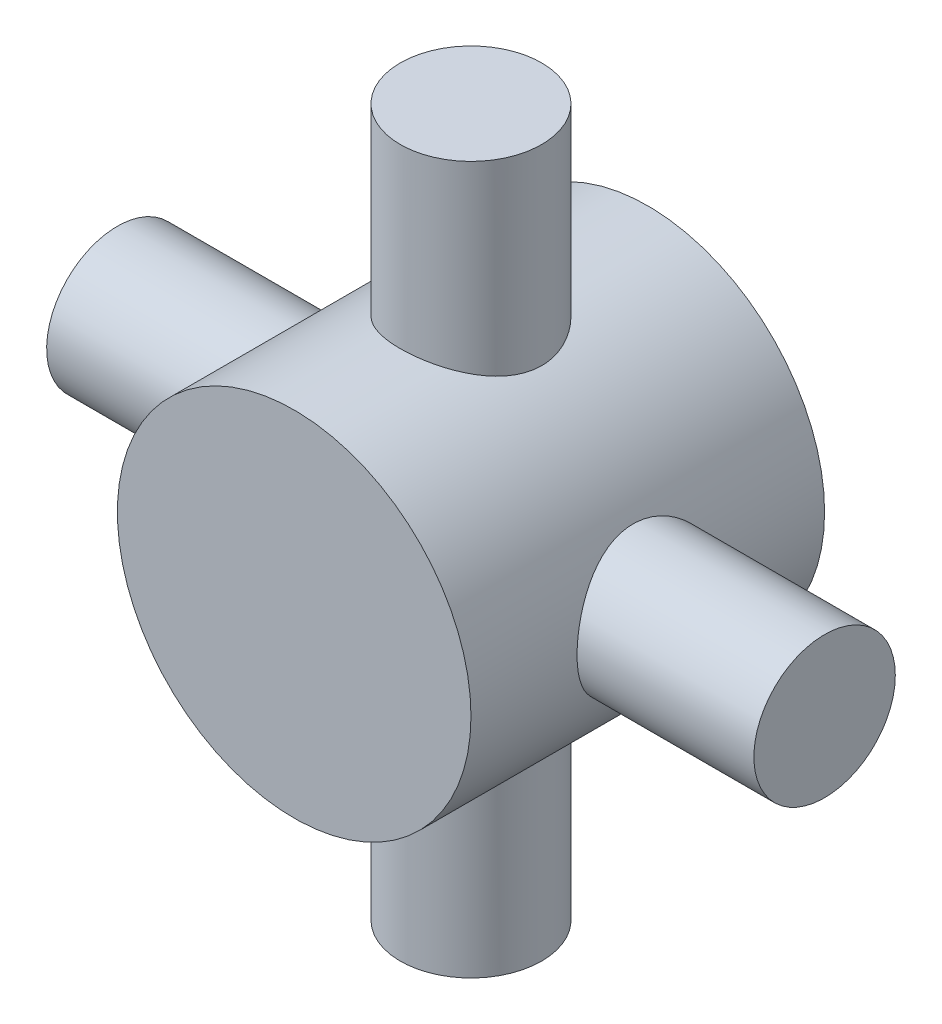
ISO-10303-21;
HEADER;
FILE_DESCRIPTION(('STEP AP214'),'2;1');
FILE_NAME('part.step','',(''),(''),'','','');
FILE_SCHEMA(('AUTOMOTIVE_DESIGN { 1 0 10303 214 1 1 1 1 }'));
ENDSEC;
DATA;
#1=APPLICATION_CONTEXT('core data for automotive mechanical design processes');
#2=APPLICATION_PROTOCOL_DEFINITION('international standard','automotive_design',2000,#1);
#3=PRODUCT_CONTEXT('',#1,'mechanical');
#4=PRODUCT('Part','Part','',(#3));
#5=PRODUCT_RELATED_PRODUCT_CATEGORY('part','',(#4));
#6=PRODUCT_DEFINITION_FORMATION('','',#4);
#7=PRODUCT_DEFINITION_CONTEXT('part definition',#1,'design');
#8=PRODUCT_DEFINITION('design','',#6,#7);
#9=PRODUCT_DEFINITION_SHAPE('','',#8);
#10=(LENGTH_UNIT() NAMED_UNIT(*) SI_UNIT(.MILLI.,.METRE.));
#11=(NAMED_UNIT(*) PLANE_ANGLE_UNIT() SI_UNIT($,.RADIAN.));
#12=(NAMED_UNIT(*) SI_UNIT($,.STERADIAN.) SOLID_ANGLE_UNIT());
#13=UNCERTAINTY_MEASURE_WITH_UNIT(LENGTH_MEASURE(1.E-05),#10,'distance_accuracy_value','');
#14=(GEOMETRIC_REPRESENTATION_CONTEXT(3) GLOBAL_UNCERTAINTY_ASSIGNED_CONTEXT((#13)) GLOBAL_UNIT_ASSIGNED_CONTEXT((#10,
#11,#12)) REPRESENTATION_CONTEXT('',''));
#15=CARTESIAN_POINT('',(0.,0.,0.));
#16=DIRECTION('',(0.,0.,1.));
#17=DIRECTION('',(1.,0.,0.));
#18=AXIS2_PLACEMENT_3D('',#15,#16,#17);
#19=CARTESIAN_POINT('',(0.,4.99999999999999,0.));
#20=DIRECTION('',(0.,-1.,0.));
#21=DIRECTION('',(0.,0.,-1.));
#22=AXIS2_PLACEMENT_3D('',#19,#20,#21);
#23=PLANE('',#22);
#24=CARTESIAN_POINT('',(0.,4.99999999999999,0.));
#25=DIRECTION('',(0.,1.,0.));
#26=DIRECTION('',(-1.,0.,0.));
#27=AXIS2_PLACEMENT_3D('',#24,#25,#26);
#28=CIRCLE('',#27,0.999999999999988);
#29=CARTESIAN_POINT('',(-0.999999999999987,4.99999999999999,0.));
#30=VERTEX_POINT('',#29);
#31=EDGE_CURVE('E20',#30,#30,#28,.F.);
#32=ORIENTED_EDGE('',*,*,#31,.F.);
#33=EDGE_LOOP('',(#32));
#34=FACE_BOUND('',#33,.T.);
#35=ADVANCED_FACE('F15',(#34),#23,.F.);
#36=CARTESIAN_POINT('',(0.,2.2750355745628,0.));
#37=DIRECTION('',(0.,1.,0.));
#38=DIRECTION('',(-1.,0.,0.));
#39=AXIS2_PLACEMENT_3D('',#36,#37,#38);
#40=CYLINDRICAL_SURFACE('',#39,0.999999999999988);
#41=ORIENTED_EDGE('',*,*,#31,.T.);
#42=EDGE_LOOP('',(#41));
#43=FACE_BOUND('',#42,.T.);
#44=CARTESIAN_POINT('',(0.999999999994078,2.29128784747409,-2.17927615693154E-07));
#45=CARTESIAN_POINT('',(0.999996707502593,2.29129119802611,0.0536136642229425));
#46=CARTESIAN_POINT('',(0.995666060081506,2.29319447821841,0.107275413313421));
#47=CARTESIAN_POINT('',(0.978520523269252,2.3005607742392,0.213017199103337));
#48=CARTESIAN_POINT('',(0.965692778855676,2.30602918345448,0.265094714008471));
#49=CARTESIAN_POINT('',(0.932120027155969,2.31980118266166,0.366020635915594));
#50=CARTESIAN_POINT('',(0.911401764908779,2.32809518535032,0.414879304143902));
#51=CARTESIAN_POINT('',(0.862717676849073,2.3465706003288,0.508430073378591));
#52=CARTESIAN_POINT('',(0.834751501712457,2.35675210358283,0.553121973420083));
#53=CARTESIAN_POINT('',(0.770660143547025,2.37850460731377,0.639631470975835));
#54=CARTESIAN_POINT('',(0.734187607655451,2.39012024880496,0.681180608037843));
#55=CARTESIAN_POINT('',(0.654852110281877,2.41306293125457,0.757766459284194));
#56=CARTESIAN_POINT('',(0.611987314896724,2.42438988829552,0.792801298050814));
#57=CARTESIAN_POINT('',(0.519003623801254,2.44601693422006,0.856702901877684));
#58=CARTESIAN_POINT('',(0.468665231928407,2.45625886886434,0.885271736656966));
#59=CARTESIAN_POINT('',(0.363413468464916,2.47401952507406,0.933421486290974));
#60=CARTESIAN_POINT('',(0.308501921956267,2.48153932665932,0.953005966559185));
#61=CARTESIAN_POINT('',(0.198483501361336,2.49269160137067,0.981670683743747));
#62=CARTESIAN_POINT('',(0.143514817362762,2.49649466443976,0.991213608518361));
#63=CARTESIAN_POINT('',(0.0326334872699018,2.50040155000967,1.00101423406867));
#64=CARTESIAN_POINT('',(-0.0232788002511603,2.5005067473981,1.00127538586105));
#65=CARTESIAN_POINT('',(-0.131116001010387,2.49710982692897,0.992758648199157));
#66=CARTESIAN_POINT('',(-0.183088476697845,2.49381000201477,0.984487662628688));
#67=CARTESIAN_POINT('',(-0.284836314035162,2.48424648527275,0.960003630832431));
#68=CARTESIAN_POINT('',(-0.334611513612494,2.47798257521011,0.9437899998154));
#69=CARTESIAN_POINT('',(-0.431449672626536,2.46298401720902,0.903681491260463));
#70=CARTESIAN_POINT('',(-0.478460369156069,2.45421351164455,0.879674394002807));
#71=CARTESIAN_POINT('',(-0.567905481629829,2.43507258232656,0.824766425613066));
#72=CARTESIAN_POINT('',(-0.610338494794237,2.42470167049934,0.793863450167871));
#73=CARTESIAN_POINT('',(-0.692378333082344,2.40260981954793,0.723680807475965));
#74=CARTESIAN_POINT('',(-0.731617771188206,2.39084494767578,0.683984933087846));
#75=CARTESIAN_POINT('',(-0.803044623935689,2.36781151648148,0.598517049002709));
#76=CARTESIAN_POINT('',(-0.835227759731151,2.35654326159149,0.552741379463758));
#77=CARTESIAN_POINT('',(-0.892473903058591,2.33547633088083,0.454755311537515));
#78=CARTESIAN_POINT('',(-0.917304382121705,2.32572950822627,0.402397233653717));
#79=CARTESIAN_POINT('',(-0.957612539624336,2.30942814837567,0.293797129279246));
#80=CARTESIAN_POINT('',(-0.973110407016686,2.30286672630767,0.237563782086274));
#81=CARTESIAN_POINT('',(-0.989051268465935,2.29604185038478,0.150637640860977));
#82=CARTESIAN_POINT('',(-0.99315014986751,2.29426714424267,0.120690248825355));
#83=CARTESIAN_POINT('',(-0.998625437813802,2.2918892002622,0.060500281623118));
#84=CARTESIAN_POINT('',(-1.00000186805585,2.29128595222701,0.0302577090281769));
#85=CARTESIAN_POINT('',(-0.999996689988203,2.2912912056767,-0.0536139948529055));
#86=CARTESIAN_POINT('',(-0.995666024435301,2.29319449377915,-0.107275745744278));
#87=CARTESIAN_POINT('',(-0.978520451059013,2.30056080503024,-0.213017531465941));
#88=CARTESIAN_POINT('',(-0.965692688262371,2.30602922154397,-0.265095044506567));
#89=CARTESIAN_POINT('',(-0.932119900214202,2.31980123381903,-0.366020959561903));
#90=CARTESIAN_POINT('',(-0.911401619995746,2.32809524228386,-0.414879622811765));
#91=CARTESIAN_POINT('',(-0.862717496636081,2.34657066678641,-0.508430379433239));
#92=CARTESIAN_POINT('',(-0.834751304161644,2.35675217379061,-0.553122271834562));
#93=CARTESIAN_POINT('',(-0.770659910571959,2.37850468306931,-0.639631752039432));
#94=CARTESIAN_POINT('',(-0.734187356486594,2.39012032625432,-0.681180879140111));
#95=CARTESIAN_POINT('',(-0.654851823652083,2.41306300933198,-0.75776670732778));
#96=CARTESIAN_POINT('',(-0.611987011004798,2.42438996530658,-0.79280153300102));
#97=CARTESIAN_POINT('',(-0.51900329064386,2.44601700514117,-0.8567031037167));
#98=CARTESIAN_POINT('',(-0.468664887376376,2.45625893479309,-0.885271919089057));
#99=CARTESIAN_POINT('',(-0.363413104525144,2.47401957871679,-0.93342162800406));
#100=CARTESIAN_POINT('',(-0.308501550024957,2.48153937301103,-0.953006086966616));
#101=CARTESIAN_POINT('',(-0.198483121880908,2.49269163160682,-0.981670760250796));
#102=CARTESIAN_POINT('',(-0.143514438322801,2.49649468616487,-0.991213663148361));
#103=CARTESIAN_POINT('',(-0.0326331133037834,2.50040155482913,-1.00101424601763));
#104=CARTESIAN_POINT('',(0.0232791695860272,2.5005067438208,-1.0012753770003));
#105=CARTESIAN_POINT('',(0.131116360536903,2.49710980798707,-0.992758600620381));
#106=CARTESIAN_POINT('',(0.183088831210155,2.49380997586689,-0.984487596582289));
#107=CARTESIAN_POINT('',(0.284836655581448,2.48424644599281,-0.960003529378298));
#108=CARTESIAN_POINT('',(0.33461184720594,2.47798253000308,-0.943789881418363));
#109=CARTESIAN_POINT('',(0.431449992117311,2.46298396116066,-0.903681338855443));
#110=CARTESIAN_POINT('',(0.478460682154936,2.45421345049765,-0.879674223901451));
#111=CARTESIAN_POINT('',(0.567905778992694,2.43507251284869,-0.824766221009757));
#112=CARTESIAN_POINT('',(0.61033878301193,2.4247015977895,-0.793863228758814));
#113=CARTESIAN_POINT('',(0.692378600396833,2.40260974233963,-0.723680551997098));
#114=CARTESIAN_POINT('',(0.731618026505073,2.39084486934377,-0.683984660331514));
#115=CARTESIAN_POINT('',(0.803044852339762,2.3678114388139,-0.598516742930602));
#116=CARTESIAN_POINT('',(0.835227973212748,2.35654318571424,-0.552741057349385));
#117=CARTESIAN_POINT('',(0.892474080528133,2.3354762628009,-0.454754963222833));
#118=CARTESIAN_POINT('',(0.91730453915312,2.32572944608067,-0.40239687570926));
#119=CARTESIAN_POINT('',(0.95761265410948,2.30942810069306,-0.293796756003865));
#120=CARTESIAN_POINT('',(0.973110499466877,2.30286668712436,-0.237563403132154));
#121=CARTESIAN_POINT('',(0.989051305568216,2.29604183431252,-0.150637373444792));
#122=CARTESIAN_POINT('',(0.99315016445451,2.29426713791307,-0.120690098920057));
#123=CARTESIAN_POINT('',(0.998625428900689,2.29188920412762,-0.060500369157009));
#124=CARTESIAN_POINT('',(1.00000185815489,2.29128595654605,-0.0302579164900438));
#125=CARTESIAN_POINT('',(0.999999999994078,2.29128784747409,-2.17927615693154E-07));
#126=B_SPLINE_CURVE_WITH_KNOTS('',3,(#44,#45,#46,#47,#48,#49,#50,#51,#52,#53,#54,#55,#56,#57,
#58,#59,#60,#61,#62,#63,#64,#65,#66,#67,#68,#69,#70,#71,#72,#73,#74,#75,#76,#77,#78,#79,#80,#81,
#82,#83,#84,#85,#86,#87,#88,#89,#90,#91,#92,#93,#94,#95,#96,#97,#98,#99,#100,#101,#102,#103,
#104,#105,#106,#107,#108,#109,#110,#111,#112,#113,#114,#115,#116,#117,#118,#119,#120,#121,#122,
#123,#124,#125),.UNSPECIFIED.,.T.,.F.,(4,2,2,2,2,2,2,2,2,2,2,2,2,2,2,2,2,2,2,2,2,2,2,2,2,2,2,2,
2,2,2,2,2,2,2,2,2,2,2,2,4),(0.,0.160722467328683,0.321688644266385,0.482114010737845,
0.64254711059031,0.811283213638927,0.98006781958772,1.15551239474912,1.33088728491167,
1.49777076455765,1.66459219531501,1.82204317578564,1.97950575060441,2.13934447256627,
2.29923203700972,2.46959649751566,2.64006398075104,2.81545564092535,2.99046650579592,
3.08117348850921,3.17187968166847,3.33260215977153,3.49356834655952,3.65399372294214,
3.814426832909,3.98316295010182,4.15194757007314,4.32739214349058,4.50276703179898,
4.66965049734785,4.83647191410893,4.99392288992339,5.15138546014328,5.31122419130196,
5.47111176495441,5.64147623732487,5.81194373256506,5.98733538957807,6.16234624997625,
6.25305287481712,6.34375871020104),.UNSPECIFIED.);
#127=CARTESIAN_POINT('',(0.999999999994078,2.29128784747409,-2.17927615693154E-07));
#128=VERTEX_POINT('',#127);
#129=EDGE_CURVE('E74',#128,#128,#126,.T.);
#130=ORIENTED_EDGE('',*,*,#129,.F.);
#131=EDGE_LOOP('',(#130));
#132=FACE_BOUND('',#131,.T.);
#133=ADVANCED_FACE('F79',(#43,#132),#40,.T.);
#134=CARTESIAN_POINT('',(4.99999999999999,0.,0.));
#135=DIRECTION('',(-1.,0.,0.));
#136=DIRECTION('',(0.,0.,1.));
#137=AXIS2_PLACEMENT_3D('',#134,#135,#136);
#138=PLANE('',#137);
#139=CARTESIAN_POINT('',(4.99999999999999,0.,0.));
#140=DIRECTION('',(1.,0.,0.));
#141=DIRECTION('',(0.,0.,-1.));
#142=AXIS2_PLACEMENT_3D('',#139,#140,#141);
#143=CIRCLE('',#142,0.999999999999988);
#144=CARTESIAN_POINT('',(4.99999999999999,0.,-0.999999999999988));
#145=VERTEX_POINT('',#144);
#146=EDGE_CURVE('E72',#145,#145,#143,.F.);
#147=ORIENTED_EDGE('',*,*,#146,.F.);
#148=EDGE_LOOP('',(#147));
#149=FACE_BOUND('',#148,.T.);
#150=ADVANCED_FACE('F84',(#149),#138,.F.);
#151=CARTESIAN_POINT('',(-4.99999999999999,0.,0.));
#152=DIRECTION('',(1.,0.,0.));
#153=DIRECTION('',(0.,0.,-1.));
#154=AXIS2_PLACEMENT_3D('',#151,#152,#153);
#155=PLANE('',#154);
#156=CARTESIAN_POINT('',(-4.99999999999999,0.,0.));
#157=DIRECTION('',(-1.,0.,0.));
#158=DIRECTION('',(0.,-1.,0.));
#159=AXIS2_PLACEMENT_3D('',#156,#157,#158);
#160=CIRCLE('',#159,0.999999999999988);
#161=CARTESIAN_POINT('',(-4.99999999999999,-0.999999999999987,0.));
#162=VERTEX_POINT('',#161);
#163=EDGE_CURVE('E69',#162,#162,#160,.F.);
#164=ORIENTED_EDGE('',*,*,#163,.F.);
#165=EDGE_LOOP('',(#164));
#166=FACE_BOUND('',#165,.T.);
#167=ADVANCED_FACE('F88',(#166),#155,.F.);
#168=CARTESIAN_POINT('',(0.,-4.99999999999999,0.));
#169=DIRECTION('',(0.,1.,0.));
#170=DIRECTION('',(0.,0.,1.));
#171=AXIS2_PLACEMENT_3D('',#168,#169,#170);
#172=PLANE('',#171);
#173=CARTESIAN_POINT('',(0.,-4.99999999999999,0.));
#174=DIRECTION('',(0.,-1.,0.));
#175=DIRECTION('',(1.,0.,0.));
#176=AXIS2_PLACEMENT_3D('',#173,#174,#175);
#177=CIRCLE('',#176,0.999999999999988);
#178=CARTESIAN_POINT('',(0.999999999999987,-4.99999999999999,0.));
#179=VERTEX_POINT('',#178);
#180=EDGE_CURVE('E66',#179,#179,#177,.F.);
#181=ORIENTED_EDGE('',*,*,#180,.F.);
#182=EDGE_LOOP('',(#181));
#183=FACE_BOUND('',#182,.T.);
#184=ADVANCED_FACE('F91',(#183),#172,.F.);
#185=CARTESIAN_POINT('',(0.,0.,-2.50000000000001));
#186=DIRECTION('',(0.,0.,-1.));
#187=DIRECTION('',(-1.,0.,0.));
#188=AXIS2_PLACEMENT_3D('',#185,#186,#187);
#189=PLANE('',#188);
#190=CARTESIAN_POINT('',(0.,0.,-2.50000000000001));
#191=DIRECTION('',(0.,0.,1.));
#192=DIRECTION('',(1.,0.,0.));
#193=AXIS2_PLACEMENT_3D('',#190,#191,#192);
#194=CIRCLE('',#193,2.50000000000001);
#195=CARTESIAN_POINT('',(2.50000000000001,0.,-2.50000000000001));
#196=VERTEX_POINT('',#195);
#197=EDGE_CURVE('E63',#196,#196,#194,.T.);
#198=ORIENTED_EDGE('',*,*,#197,.F.);
#199=EDGE_LOOP('',(#198));
#200=FACE_BOUND('',#199,.T.);
#201=ADVANCED_FACE('F54',(#200),#189,.T.);
#202=CARTESIAN_POINT('',(2.2750355745628,0.,0.));
#203=DIRECTION('',(1.,0.,0.));
#204=DIRECTION('',(0.,0.,-1.));
#205=AXIS2_PLACEMENT_3D('',#202,#203,#204);
#206=CYLINDRICAL_SURFACE('',#205,0.999999999999988);
#207=ORIENTED_EDGE('',*,*,#146,.T.);
#208=EDGE_LOOP('',(#207));
#209=FACE_BOUND('',#208,.T.);
#210=CARTESIAN_POINT('',(2.50000000000001,0.,-0.999999999999988));
#211=CARTESIAN_POINT('',(2.49999832714328,-0.053840173868081,-0.999997923084856));
#212=CARTESIAN_POINT('',(2.4982435108474,-0.10770267365812,-0.995633281938908));
#213=CARTESIAN_POINT('',(2.4914068441987,-0.213839462081154,-0.978350168268459));
#214=CARTESIAN_POINT('',(2.4863224345941,-0.266112496622602,-0.965425115799957));
#215=CARTESIAN_POINT('',(2.47337266537937,-0.367468219325445,-0.931566052287496));
#216=CARTESIAN_POINT('',(2.46551432763939,-0.416558596001349,-0.910652252929983));
#217=CARTESIAN_POINT('',(2.4477875356438,-0.510514648709454,-0.86150327055249));
#218=CARTESIAN_POINT('',(2.43791886017528,-0.555379859018935,-0.833267281722236));
#219=CARTESIAN_POINT('',(2.41665468324853,-0.64174973025198,-0.768883093669729));
#220=CARTESIAN_POINT('',(2.40521199792037,-0.683029284074287,-0.732448671320707));
#221=CARTESIAN_POINT('',(2.38230341582586,-0.759085887708245,-0.653301606641646));
#222=CARTESIAN_POINT('',(2.37083750993646,-0.793859458713734,-0.610585627184905));
#223=CARTESIAN_POINT('',(2.34860907848086,-0.857451007629905,-0.517767074361221));
#224=CARTESIAN_POINT('',(2.3379012953495,-0.885931238379492,-0.467418866047939));
#225=CARTESIAN_POINT('',(2.31916147879465,-0.93389465983473,-0.362179664845194));
#226=CARTESIAN_POINT('',(2.31112591285993,-0.953389741641312,-0.307294790033432));
#227=CARTESIAN_POINT('',(2.30054811890686,-0.978574006495495,-0.210171444971434));
#228=CARTESIAN_POINT('',(2.2971019719271,-0.986588200391506,-0.168621393484938));
#229=CARTESIAN_POINT('',(2.29247113496057,-0.997301589242009,-0.0847188971027677));
#230=CARTESIAN_POINT('',(2.2912860398814,-1.00000173626936,-0.0423665973121838));
#231=CARTESIAN_POINT('',(2.29129013633143,-0.999997801463861,0.0536458434076669));
#232=CARTESIAN_POINT('',(2.29319546594728,-0.995663492002343,0.107314479498848));
#233=CARTESIAN_POINT('',(2.30056461630025,-0.978511854714129,0.213047361261767));
#234=CARTESIAN_POINT('',(2.30603150712417,-0.96568720801193,0.265110182121807));
#235=CARTESIAN_POINT('',(2.31980070632238,-0.932121094951657,0.366018700844813));
#236=CARTESIAN_POINT('',(2.32809419246134,-0.911404237975104,0.414873851191407));
#237=CARTESIAN_POINT('',(2.34656942823428,-0.862720907739187,0.508424566484586));
#238=CARTESIAN_POINT('',(2.35675148920328,-0.834753238867404,0.553119443775409));
#239=CARTESIAN_POINT('',(2.37850390718751,-0.770662283209919,0.639628777297083));
#240=CARTESIAN_POINT('',(2.39011879893465,-0.734192491464488,0.681175400915639));
#241=CARTESIAN_POINT('',(2.41306151143783,-0.654857149705665,0.757762087294584));
#242=CARTESIAN_POINT('',(2.42438921190131,-0.611988969805669,0.792799461246696));
#243=CARTESIAN_POINT('',(2.44602157014783,-0.518984995119655,0.856716431504877));
#244=CARTESIAN_POINT('',(2.45626751101058,-0.468627741475795,0.885295186015296));
#245=CARTESIAN_POINT('',(2.47402583332619,-0.363362385819108,0.933438562460561));
#246=CARTESIAN_POINT('',(2.48154157462813,-0.308459980099774,0.953014271709865));
#247=CARTESIAN_POINT('',(2.49141035181088,-0.21113755206582,0.978375646143846));
#248=CARTESIAN_POINT('',(2.49461196692088,-0.169390197125353,0.98646499025934));
#249=CARTESIAN_POINT('',(2.49890731681082,-0.0850998091062024,0.997277643475411));
#250=CARTESIAN_POINT('',(2.500001322272,-0.0425568789123114,1.0000016416507));
#251=CARTESIAN_POINT('',(2.49999832714815,0.0538401739827356,0.999997923091098));
#252=CARTESIAN_POINT('',(2.4982435108445,0.107702673798753,0.995633281930207));
#253=CARTESIAN_POINT('',(2.49140684418548,0.213839462190523,0.978350168236428));
#254=CARTESIAN_POINT('',(2.48632243458614,0.266112496678589,0.965425115779619));
#255=CARTESIAN_POINT('',(2.47337266538141,0.367468219315742,0.931566052292367));
#256=CARTESIAN_POINT('',(2.46551432764361,0.416558595976571,0.910652252941023));
#257=CARTESIAN_POINT('',(2.44778753564888,0.51051464868494,0.861503270567236));
#258=CARTESIAN_POINT('',(2.43791886017799,0.555379859007548,0.833267281730693));
#259=CARTESIAN_POINT('',(2.41665468324576,0.641749730263672,0.768883093661046));
#260=CARTESIAN_POINT('',(2.40521199791446,0.683029284095803,0.732448671301014));
#261=CARTESIAN_POINT('',(2.38230341581995,0.759085887725992,0.653301606620479));
#262=CARTESIAN_POINT('',(2.37083750993369,0.793859458721245,0.610585627176497));
#263=CARTESIAN_POINT('',(2.34860907849422,0.857451007592112,0.517767074413713));
#264=CARTESIAN_POINT('',(2.33790129537461,0.885931238314277,0.467418866153549));
#265=CARTESIAN_POINT('',(2.31916147881392,0.933894659786355,0.362179664988715));
#266=CARTESIAN_POINT('',(2.31112591286788,0.95338974161609,0.307294790150817));
#267=CARTESIAN_POINT('',(2.30054811510167,0.978574015559668,0.210171410000802));
#268=CARTESIAN_POINT('',(2.29710196602288,0.986588214136999,0.168621322197774));
#269=CARTESIAN_POINT('',(2.29247112894675,0.997301603067924,0.0847187524801078));
#270=CARTESIAN_POINT('',(2.29128603585487,1.00000174549937,0.0423664156711983));
#271=CARTESIAN_POINT('',(2.2912901414281,0.999997789778293,-0.0536460637138275));
#272=CARTESIAN_POINT('',(2.29319547631843,0.995663468239362,-0.107314700976306));
#273=CARTESIAN_POINT('',(2.30056463681906,0.978511806598473,-0.213047582723829));
#274=CARTESIAN_POINT('',(2.30603153251083,0.965687147632724,-0.265110402397518));
#275=CARTESIAN_POINT('',(2.31980074042958,0.932121010316976,-0.366018916626548));
#276=CARTESIAN_POINT('',(2.32809423042287,0.911404141351788,-0.414874063673542));
#277=CARTESIAN_POINT('',(2.34656947254699,0.862720787577108,-0.508424770557167));
#278=CARTESIAN_POINT('',(2.35675153601288,0.834753107154189,-0.553119642737114));
#279=CARTESIAN_POINT('',(2.37850395768848,0.770662127901707,-0.639628964662389));
#280=CARTESIAN_POINT('',(2.39011885056112,0.734192324040813,-0.681175581628587));
#281=CARTESIAN_POINT('',(2.4130615634834,0.654856958642804,-0.757762252639386));
#282=CARTESIAN_POINT('',(2.42438926323968,0.611988767218563,-0.79279961787407));
#283=CARTESIAN_POINT('',(2.4460216174424,0.518984772951155,-0.856716566102425));
#284=CARTESIAN_POINT('',(2.45626755498718,0.468627511651131,-0.885295307699411));
#285=CARTESIAN_POINT('',(2.47402586910357,0.363362143029287,-0.933438656976586));
#286=CARTESIAN_POINT('',(2.48154160553418,0.308459732011866,-0.953014351999295));
#287=CARTESIAN_POINT('',(2.4914103692168,0.211137339008969,-0.978375690264006));
#288=CARTESIAN_POINT('',(2.49461197787209,0.169390025231055,-0.986465017903118));
#289=CARTESIAN_POINT('',(2.49890731906129,0.0850997219612367,-0.997277649063196));
#290=CARTESIAN_POINT('',(2.50000132227449,0.0425568353532825,-1.00000164165396));
#291=CARTESIAN_POINT('',(2.50000000000001,0.,-0.999999999999988));
#292=B_SPLINE_CURVE_WITH_KNOTS('',3,(#210,#211,#212,#213,#214,#215,#216,#217,#218,#219,#220,
#221,#222,#223,#224,#225,#226,#227,#228,#229,#230,#231,#232,#233,#234,#235,#236,#237,#238,#239,
#240,#241,#242,#243,#244,#245,#246,#247,#248,#249,#250,#251,#252,#253,#254,#255,#256,#257,#258,
#259,#260,#261,#262,#263,#264,#265,#266,#267,#268,#269,#270,#271,#272,#273,#274,#275,#276,#277,
#278,#279,#280,#281,#282,#283,#284,#285,#286,#287,#288,#289,#290,#291),.UNSPECIFIED.,.T.,.F.,(4,
2,2,2,2,2,2,2,2,2,2,2,2,2,2,2,2,2,2,2,2,2,2,2,2,2,2,2,2,2,2,2,2,2,2,2,2,2,2,2,4),(0.,
0.161358816058386,0.322841804431311,0.48391891505938,0.645013759824909,0.812983083447207,
0.981041966649066,1.15665108370802,1.33202712454866,1.45902009098211,1.58599030308716,
1.74676523562868,1.90767894081388,2.0680949405241,2.22853740864722,2.39726299193862,
2.56605811733116,2.74157622448184,2.91687759719383,3.04443680049976,3.17197962022939,
3.3333384364772,3.49482142466068,3.65589853524664,3.81699338005428,3.98496270371981,
4.15302158687844,4.3286307037304,4.50400674477799,4.6309998199689,4.75797014073239,
4.91874508025775,5.07965879220759,5.24007479858073,5.40051727339182,5.56924286606018,
5.73803800085389,5.91355610706353,6.08885747831783,6.21641655109891,6.34395924040416),.UNSPECIFIED.);
#293=CARTESIAN_POINT('',(2.50000000000001,0.,-0.999999999999988));
#294=VERTEX_POINT('',#293);
#295=EDGE_CURVE('E58',#294,#294,#292,.T.);
#296=ORIENTED_EDGE('',*,*,#295,.F.);
#297=EDGE_LOOP('',(#296));
#298=FACE_BOUND('',#297,.T.);
#299=ADVANCED_FACE('F49',(#209,#298),#206,.T.);
#300=CARTESIAN_POINT('',(0.,0.,2.50000000000001));
#301=DIRECTION('',(0.,0.,-1.));
#302=DIRECTION('',(-1.,0.,0.));
#303=AXIS2_PLACEMENT_3D('',#300,#301,#302);
#304=PLANE('',#303);
#305=CARTESIAN_POINT('',(0.,0.,2.50000000000001));
#306=DIRECTION('',(0.,0.,1.));
#307=DIRECTION('',(1.,0.,0.));
#308=AXIS2_PLACEMENT_3D('',#305,#306,#307);
#309=CIRCLE('',#308,2.50000000000001);
#310=CARTESIAN_POINT('',(2.50000000000001,0.,2.50000000000001));
#311=VERTEX_POINT('',#310);
#312=EDGE_CURVE('E29',#311,#311,#309,.F.);
#313=ORIENTED_EDGE('',*,*,#312,.F.);
#314=EDGE_LOOP('',(#313));
#315=FACE_BOUND('',#314,.T.);
#316=ADVANCED_FACE('F45',(#315),#304,.F.);
#317=CARTESIAN_POINT('',(-2.2750355745628,0.,0.));
#318=DIRECTION('',(-1.,0.,0.));
#319=DIRECTION('',(0.,-1.,0.));
#320=AXIS2_PLACEMENT_3D('',#317,#318,#319);
#321=CYLINDRICAL_SURFACE('',#320,0.999999999999988);
#322=CARTESIAN_POINT('',(-2.29128784747793,0.999999999999988,0.));
#323=CARTESIAN_POINT('',(-2.2912901414281,0.999997789778294,0.0536460637138044));
#324=CARTESIAN_POINT('',(-2.29319547631843,0.995663468239366,0.107314700976259));
#325=CARTESIAN_POINT('',(-2.30056463681906,0.978511806598484,0.213047582723784));
#326=CARTESIAN_POINT('',(-2.30603153251082,0.965687147632732,0.265110402397497));
#327=CARTESIAN_POINT('',(-2.31980074042958,0.932121010316974,0.366018916626553));
#328=CARTESIAN_POINT('',(-2.32809423042288,0.911404141351783,0.414874063673554));
#329=CARTESIAN_POINT('',(-2.34656947254699,0.862720787577102,0.508424770557177));
#330=CARTESIAN_POINT('',(-2.35675153601288,0.834753107154186,0.553119642737118));
#331=CARTESIAN_POINT('',(-2.37850395768848,0.770662127901703,0.639628964662395));
#332=CARTESIAN_POINT('',(-2.39011885056113,0.734192324040805,0.681175581628597));
#333=CARTESIAN_POINT('',(-2.4130615634834,0.654856958642794,0.757762252639394));
#334=CARTESIAN_POINT('',(-2.42438926323968,0.611988767218557,0.792799617874074));
#335=CARTESIAN_POINT('',(-2.4460216174424,0.518984772951177,0.856716566102411));
#336=CARTESIAN_POINT('',(-2.45626755498717,0.468627511651176,0.885295307699386));
#337=CARTESIAN_POINT('',(-2.47402586910357,0.363362143029336,0.933438656976569));
#338=CARTESIAN_POINT('',(-2.48154160553418,0.308459732011891,0.953014351999288));
#339=CARTESIAN_POINT('',(-2.4914103692168,0.21113733900894,0.978375690264014));
#340=CARTESIAN_POINT('',(-2.4946119778721,0.169390025230996,0.986465017903129));
#341=CARTESIAN_POINT('',(-2.49890731906129,0.0850997219611769,0.9972776490632));
#342=CARTESIAN_POINT('',(-2.50000132227449,0.0425568353532529,1.00000164165396));
#343=CARTESIAN_POINT('',(-2.49999832714328,-0.0538401738681144,0.999997923084856));
#344=CARTESIAN_POINT('',(-2.4982435108474,-0.107702673658188,0.9956332819389));
#345=CARTESIAN_POINT('',(-2.49140684419869,-0.213839462081219,0.978350168268445));
#346=CARTESIAN_POINT('',(-2.48632243459409,-0.266112496622633,0.965425115799954));
#347=CARTESIAN_POINT('',(-2.47337266537948,-0.367468219324606,0.931566052287768));
#348=CARTESIAN_POINT('',(-2.46551432763965,-0.416558595999723,0.910652252930647));
#349=CARTESIAN_POINT('',(-2.44778753564413,-0.510514648707954,0.86150327055346));
#350=CARTESIAN_POINT('',(-2.43791886017546,-0.55537985901821,0.833267281722877));
#351=CARTESIAN_POINT('',(-2.41665468324732,-0.641749730256934,0.76888309366593));
#352=CARTESIAN_POINT('',(-2.4052119979178,-0.68302928408361,0.73244867131209));
#353=CARTESIAN_POINT('',(-2.38230341582329,-0.759085887715982,0.65330160663251));
#354=CARTESIAN_POINT('',(-2.37083750993526,-0.793859458716975,0.610585627181468));
#355=CARTESIAN_POINT('',(-2.34860907848753,-0.857451007611009,0.51776707438745));
#356=CARTESIAN_POINT('',(-2.33790129536205,-0.8859312383469,0.467418866100711));
#357=CARTESIAN_POINT('',(-2.31916147880428,-0.933894659810557,0.36217966491692));
#358=CARTESIAN_POINT('',(-2.3111259128639,-0.953389741628706,0.307294790092107));
#359=CARTESIAN_POINT('',(-2.30054811700427,-0.97857401102757,0.210171427486158));
#360=CARTESIAN_POINT('',(-2.297101968975,-0.986588207264237,0.168621357841436));
#361=CARTESIAN_POINT('',(-2.29247113195367,-0.997301596154945,0.084718824791668));
#362=CARTESIAN_POINT('',(-2.29128603786814,-1.00000174088435,0.042366506492031));
#363=CARTESIAN_POINT('',(-2.29129013887975,-0.999997795621107,-0.0536459535603412));
#364=CARTESIAN_POINT('',(-2.29319547113284,-0.9956634801209,-0.107314590237216));
#365=CARTESIAN_POINT('',(-2.30056462655963,-0.978511830656361,-0.213047471992572));
#366=CARTESIAN_POINT('',(-2.30603151981748,-0.965687177822376,-0.265110292259526));
#367=CARTESIAN_POINT('',(-2.31980072337597,-0.93212105263435,-0.36601880873561));
#368=CARTESIAN_POINT('',(-2.32809421144209,-0.911404189663491,-0.414873957432389));
#369=CARTESIAN_POINT('',(-2.34656945039061,-0.862720847658228,-0.508424668520751));
#370=CARTESIAN_POINT('',(-2.35675151260805,-0.834753173010901,-0.553119543256113));
#371=CARTESIAN_POINT('',(-2.37850393243795,-0.770662205555952,-0.639628870979581));
#372=CARTESIAN_POINT('',(-2.39011882474784,-0.734192407752794,-0.68117549127197));
#373=CARTESIAN_POINT('',(-2.41306153746057,-0.654857054174396,-0.757762169966856));
#374=CARTESIAN_POINT('',(-2.42438923757045,-0.61198886851229,-0.792799539560258));
#375=CARTESIAN_POINT('',(-2.44602159379508,-0.518984884035621,-0.856716498803528));
#376=CARTESIAN_POINT('',(-2.45626753299884,-0.468627626563709,-0.885295246857232));
#377=CARTESIAN_POINT('',(-2.47402585121485,-0.363362264424457,-0.933438609718483));
#378=CARTESIAN_POINT('',(-2.48154159008113,-0.308459856056059,-0.953014311854513));
#379=CARTESIAN_POINT('',(-2.49141036051383,-0.211137445537548,-0.978375668203901));
#380=CARTESIAN_POINT('',(-2.49461197239648,-0.169390111178291,-0.98646500408122));
#381=CARTESIAN_POINT('',(-2.49890731793606,-0.0850997655337333,-0.997277646269304));
#382=CARTESIAN_POINT('',(-2.50000132227324,-0.0425568571328039,-1.00000164165233));
#383=CARTESIAN_POINT('',(-2.49999832714572,0.0538401739254423,-0.999997923087976));
#384=CARTESIAN_POINT('',(-2.49824351084595,0.107702673728505,-0.99563328193455));
#385=CARTESIAN_POINT('',(-2.49140684419208,0.213839462135904,-0.978350168252429));
#386=CARTESIAN_POINT('',(-2.48632243459011,0.266112496650627,-0.965425115789785));
#387=CARTESIAN_POINT('',(-2.4733726653805,0.367468219319755,-0.931566052290204));
#388=CARTESIAN_POINT('',(-2.46551432764176,0.416558595987334,-0.910652252936168));
#389=CARTESIAN_POINT('',(-2.44778753564667,0.510514648695697,-0.861503270560833));
#390=CARTESIAN_POINT('',(-2.43791886017681,0.555379859012516,-0.833267281727106));
#391=CARTESIAN_POINT('',(-2.41665468324593,0.641749730262781,-0.768883093661589));
#392=CARTESIAN_POINT('',(-2.40521199791484,0.683029284094368,-0.732448671302243));
#393=CARTESIAN_POINT('',(-2.38230341582034,0.759085887724856,-0.653301606621926));
#394=CARTESIAN_POINT('',(-2.37083750993387,0.793859458720731,-0.610585627177264));
#395=CARTESIAN_POINT('',(-2.34860907849421,0.857451007592113,-0.517767074413695));
#396=CARTESIAN_POINT('',(-2.3379012953746,0.885931238314293,-0.467418866153517));
#397=CARTESIAN_POINT('',(-2.31916147881392,0.933894659786371,-0.36217966498868));
#398=CARTESIAN_POINT('',(-2.31112591286788,0.953389741616095,-0.307294790150799));
#399=CARTESIAN_POINT('',(-2.30054811510167,0.978574015559676,-0.21017141000077));
#400=CARTESIAN_POINT('',(-2.29710196602288,0.986588214137012,-0.168621322197708));
#401=CARTESIAN_POINT('',(-2.29247112894675,0.997301603067929,-0.0847187524800404));
#402=CARTESIAN_POINT('',(-2.29128603585487,1.00000174549937,-0.0423664156711646));
#403=CARTESIAN_POINT('',(-2.29128784747793,0.999999999999988,0.));
#404=B_SPLINE_CURVE_WITH_KNOTS('',3,(#322,#323,#324,#325,#326,#327,#328,#329,#330,#331,#332,
#333,#334,#335,#336,#337,#338,#339,#340,#341,#342,#343,#344,#345,#346,#347,#348,#349,#350,#351,
#352,#353,#354,#355,#356,#357,#358,#359,#360,#361,#362,#363,#364,#365,#366,#367,#368,#369,#370,
#371,#372,#373,#374,#375,#376,#377,#378,#379,#380,#381,#382,#383,#384,#385,#386,#387,#388,#389,
#390,#391,#392,#393,#394,#395,#396,#397,#398,#399,#400,#401,#402,#403),.UNSPECIFIED.,.T.,.F.,(4,
2,2,2,2,2,2,2,2,2,2,2,2,2,2,2,2,2,2,2,2,2,2,2,2,2,2,2,2,2,2,2,2,2,2,2,2,2,2,2,4),(0.,
0.160774939525288,0.321688651475196,0.482104657848362,0.642547132659429,0.81127272532781,
0.9800678601215,1.15558596633106,1.33088733758543,1.45844641036661,1.58598909967177,
1.74734791573026,1.90883090410308,2.06990801472848,2.23100285949668,2.39897218313776,
2.56703106632084,2.74264018327635,2.91801622422041,3.04500924503247,3.17197951146641,
3.33275444749997,3.49366815606776,3.65408415910938,3.81452663057639,3.98325221855628,
4.15204734864938,4.32756545532947,4.50286682731269,4.6304259653564,4.75796871987386,
4.91932753602706,5.08081052430516,5.2418876349095,5.40298247969876,5.57095180336146,
5.73901068652292,5.91461980337494,6.08999584442247,6.21698891961348,6.34395924037687),.UNSPECIFIED.);
#405=CARTESIAN_POINT('',(-2.29128784747793,0.999999999999988,0.));
#406=VERTEX_POINT('',#405);
#407=EDGE_CURVE('E24',#406,#406,#404,.T.);
#408=ORIENTED_EDGE('',*,*,#407,.F.);
#409=EDGE_LOOP('',(#408));
#410=FACE_BOUND('',#409,.T.);
#411=ORIENTED_EDGE('',*,*,#163,.T.);
#412=EDGE_LOOP('',(#411));
#413=FACE_BOUND('',#412,.T.);
#414=ADVANCED_FACE('F40',(#410,#413),#321,.T.);
#415=CARTESIAN_POINT('',(0.,-2.2750355745628,0.));
#416=DIRECTION('',(0.,-1.,0.));
#417=DIRECTION('',(1.,0.,0.));
#418=AXIS2_PLACEMENT_3D('',#415,#416,#417);
#419=CYLINDRICAL_SURFACE('',#418,0.999999999999988);
#420=ORIENTED_EDGE('',*,*,#180,.T.);
#421=EDGE_LOOP('',(#420));
#422=FACE_BOUND('',#421,.T.);
#423=CARTESIAN_POINT('',(0.999999999994105,-2.29128784747409,-1.08963790179697E-07));
#424=CARTESIAN_POINT('',(0.999996689980388,-2.29129120567163,-0.0536139948537216));
#425=CARTESIAN_POINT('',(0.995666024433116,-2.29319449377783,-0.107275745745175));
#426=CARTESIAN_POINT('',(0.978520451060956,-2.30056080503167,-0.21301753146656));
#427=CARTESIAN_POINT('',(0.965692688262842,-2.30602922154437,-0.265095044506832));
#428=CARTESIAN_POINT('',(0.932119900213692,-2.31980123381865,-0.366020959561758));
#429=CARTESIAN_POINT('',(0.911401619995689,-2.32809524228373,-0.414879622811548));
#430=CARTESIAN_POINT('',(0.862717496636352,-2.34657066678646,-0.508430379433046));
#431=CARTESIAN_POINT('',(0.834751304161766,-2.35675217379061,-0.55312227183445));
#432=CARTESIAN_POINT('',(0.770659910571919,-2.37850468306928,-0.639631752039432));
#433=CARTESIAN_POINT('',(0.734187356486552,-2.39012032625432,-0.681180879140146));
#434=CARTESIAN_POINT('',(0.654851823652059,-2.413063009332,-0.757766707327808));
#435=CARTESIAN_POINT('',(0.611987011004803,-2.42438996530658,-0.792801533001016));
#436=CARTESIAN_POINT('',(0.519003290643917,-2.44601700514116,-0.856703103716662));
#437=CARTESIAN_POINT('',(0.468664887376454,-2.45625893479308,-0.885271919089014));
#438=CARTESIAN_POINT('',(0.363413104525229,-2.47401957871677,-0.933421628004028));
#439=CARTESIAN_POINT('',(0.308501550025025,-2.48153937301102,-0.953006086966595));
#440=CARTESIAN_POINT('',(0.198483121880956,-2.49269163160681,-0.981670760250787));
#441=CARTESIAN_POINT('',(0.143514438322845,-2.49649468616487,-0.991213663148354));
#442=CARTESIAN_POINT('',(0.0326331133038267,-2.50040155482913,-1.00101424601763));
#443=CARTESIAN_POINT('',(-0.023279169585981,-2.5005067438208,-1.0012753770003));
#444=CARTESIAN_POINT('',(-0.131116360536861,-2.49710980798707,-0.992758600620387));
#445=CARTESIAN_POINT('',(-0.183088831210119,-2.4938099758669,-0.984487596582296));
#446=CARTESIAN_POINT('',(-0.284836655581414,-2.48424644599282,-0.960003529378308));
#447=CARTESIAN_POINT('',(-0.3346118472059,-2.47798253000309,-0.943789881418376));
#448=CARTESIAN_POINT('',(-0.431449992117248,-2.46298396116067,-0.903681338855472));
#449=CARTESIAN_POINT('',(-0.478460682154853,-2.45421345049767,-0.879674223901494));
#450=CARTESIAN_POINT('',(-0.56790577899262,-2.4350725128487,-0.82476622100981));
#451=CARTESIAN_POINT('',(-0.610338783011879,-2.42470159778952,-0.793863228758858));
#452=CARTESIAN_POINT('',(-0.692378600396839,-2.40260974233963,-0.723680551997094));
#453=CARTESIAN_POINT('',(-0.731618026505106,-2.39084486934374,-0.683984660331466));
#454=CARTESIAN_POINT('',(-0.803044852339816,-2.3678114388139,-0.598516742930545));
#455=CARTESIAN_POINT('',(-0.83522797321281,-2.35654318571428,-0.552741057349378));
#456=CARTESIAN_POINT('',(-0.892474080527993,-2.33547626280089,-0.454754963222969));
#457=CARTESIAN_POINT('',(-0.917304539152773,-2.32572944608056,-0.402396875709496));
#458=CARTESIAN_POINT('',(-0.957612654109642,-2.30942810069324,-0.293796756004129));
#459=CARTESIAN_POINT('',(-0.973110499467721,-2.30286668712495,-0.237563403132331));
#460=CARTESIAN_POINT('',(-0.989051305567746,-2.29604183431223,-0.150637373444874));
#461=CARTESIAN_POINT('',(-0.993150164453177,-2.29426713791222,-0.120690098920161));
#462=CARTESIAN_POINT('',(-0.998625428901981,-2.29188920412849,-0.0605003691573523));
#463=CARTESIAN_POINT('',(-1.00000185815968,-2.29128595654921,-0.0302579164906042));
#464=CARTESIAN_POINT('',(-0.999996707510424,-2.29129119803119,0.0536136642220805));
#465=CARTESIAN_POINT('',(-0.9956660600837,-2.29319447821973,0.107275413312477));
#466=CARTESIAN_POINT('',(-0.978520523267315,-2.30056077423777,0.213017199102673));
#467=CARTESIAN_POINT('',(-0.965692778855215,-2.30602918345407,0.26509471400816));
#468=CARTESIAN_POINT('',(-0.932120027156496,-2.31980118266204,0.366020635915696));
#469=CARTESIAN_POINT('',(-0.911401764908855,-2.32809518535045,0.414879304144076));
#470=CARTESIAN_POINT('',(-0.862717676848826,-2.34657060032874,0.508430073378743));
#471=CARTESIAN_POINT('',(-0.834751501712361,-2.35675210358282,0.553121973420155));
#472=CARTESIAN_POINT('',(-0.770660143547097,-2.37850460731379,0.639631470975798));
#473=CARTESIAN_POINT('',(-0.734187607655526,-2.39012024880495,0.681180608037772));
#474=CARTESIAN_POINT('',(-0.65485211028194,-2.41306293125455,0.757766459284133));
#475=CARTESIAN_POINT('',(-0.61198731489676,-2.4243898882955,0.792801298050787));
#476=CARTESIAN_POINT('',(-0.519003623801242,-2.44601693422006,0.856702901877695));
#477=CARTESIAN_POINT('',(-0.468665231928374,-2.45625886886435,0.885271736656985));
#478=CARTESIAN_POINT('',(-0.363413468464879,-2.47401952507406,0.933421486290987));
#479=CARTESIAN_POINT('',(-0.308501921956248,-2.48153932665932,0.95300596655919));
#480=CARTESIAN_POINT('',(-0.19848350136134,-2.49269160137067,0.981670683743747));
#481=CARTESIAN_POINT('',(-0.143514817362768,-2.49649466443976,0.991213608518359));
#482=CARTESIAN_POINT('',(-0.0326334872699087,-2.50040155000967,1.00101423406867));
#483=CARTESIAN_POINT('',(0.023278800251157,-2.5005067473981,1.00127538586105));
#484=CARTESIAN_POINT('',(0.131116001010381,-2.49710982692897,0.992758648199158));
#485=CARTESIAN_POINT('',(0.183088476697833,-2.49381000201477,0.98448766262869));
#486=CARTESIAN_POINT('',(0.284836314035151,-2.48424648527275,0.960003630832435));
#487=CARTESIAN_POINT('',(0.334611513612489,-2.47798257521011,0.943789999815402));
#488=CARTESIAN_POINT('',(0.431449672626557,-2.46298401720902,0.903681491260455));
#489=CARTESIAN_POINT('',(0.47846036915611,-2.45421351164455,0.879674394002787));
#490=CARTESIAN_POINT('',(0.567905481629863,-2.43507258232655,0.82476642561304));
#491=CARTESIAN_POINT('',(0.61033849479425,-2.42470167049933,0.793863450167857));
#492=CARTESIAN_POINT('',(0.692378333082303,-2.40260981954795,0.723680807476003));
#493=CARTESIAN_POINT('',(0.731617771188139,-2.39084494767582,0.68398493308793));
#494=CARTESIAN_POINT('',(0.803044623935604,-2.36781151648149,0.598517049002806));
#495=CARTESIAN_POINT('',(0.835227759731061,-2.35654326159146,0.552741379463808));
#496=CARTESIAN_POINT('',(0.892473903058707,-2.33547633088085,0.454755311537425));
#497=CARTESIAN_POINT('',(0.917304382122031,-2.32572950822639,0.402397233653529));
#498=CARTESIAN_POINT('',(0.957612539624159,-2.3094281483755,0.293797129279033));
#499=CARTESIAN_POINT('',(0.973110407015831,-2.30286672630709,0.237563782086148));
#500=CARTESIAN_POINT('',(0.989051268466397,-2.29604185038508,0.150637640860945));
#501=CARTESIAN_POINT('',(0.993150149868835,-2.29426714424352,0.1206902488253));
#502=CARTESIAN_POINT('',(0.998625437812509,-2.29188920026133,0.0605002816228216));
#503=CARTESIAN_POINT('',(1.00000186805106,-2.29128595222385,0.0302577090276626));
#504=CARTESIAN_POINT('',(0.999999999994105,-2.29128784747409,-1.08963790179697E-07));
#505=B_SPLINE_CURVE_WITH_KNOTS('',3,(#423,#424,#425,#426,#427,#428,#429,#430,#431,#432,#433,
#434,#435,#436,#437,#438,#439,#440,#441,#442,#443,#444,#445,#446,#447,#448,#449,#450,#451,#452,
#453,#454,#455,#456,#457,#458,#459,#460,#461,#462,#463,#464,#465,#466,#467,#468,#469,#470,#471,
#472,#473,#474,#475,#476,#477,#478,#479,#480,#481,#482,#483,#484,#485,#486,#487,#488,#489,#490,
#491,#492,#493,#494,#495,#496,#497,#498,#499,#500,#501,#502,#503,#504),.UNSPECIFIED.,.T.,.F.,(4,
2,2,2,2,2,2,2,2,2,2,2,2,2,2,2,2,2,2,2,2,2,2,2,2,2,2,2,2,2,2,2,2,2,2,2,2,2,2,2,4),(0.,
0.160722478102891,0.321688664889933,0.482114041272274,0.642547151239415,0.811283268432375,
0.980067888403551,1.15551246182093,1.33088735012939,1.49777081567827,1.66459223243935,
1.82204320825382,1.97950577847369,2.13934450963231,2.29923208328483,2.46959655565546,
2.64006405089547,2.81545570790816,2.99046656830666,3.08117319314741,3.17187902853092,
3.33260149585977,3.49356767279841,3.65399303927015,3.81442613912234,3.98316224217081,
4.15194684811975,4.32739142328121,4.5027663134437,4.66964979308967,4.83647122384703,
4.99392220431765,5.15138477913643,5.31122350109837,5.47111106554175,5.6414755260475,
5.81194300928307,5.9873346694577,6.16234553432795,6.25305251704137,6.34375871020104),.UNSPECIFIED.);
#506=CARTESIAN_POINT('',(0.999999999994105,-2.29128784747409,-1.08963790179697E-07));
#507=VERTEX_POINT('',#506);
#508=EDGE_CURVE('E10',#507,#507,#505,.T.);
#509=ORIENTED_EDGE('',*,*,#508,.F.);
#510=EDGE_LOOP('',(#509));
#511=FACE_BOUND('',#510,.T.);
#512=ADVANCED_FACE('F37',(#422,#511),#419,.T.);
#513=CARTESIAN_POINT('',(0.,0.,-2.50000000000001));
#514=DIRECTION('',(0.,0.,1.));
#515=DIRECTION('',(1.,0.,0.));
#516=AXIS2_PLACEMENT_3D('',#513,#514,#515);
#517=CYLINDRICAL_SURFACE('',#516,2.50000000000001);
#518=ORIENTED_EDGE('',*,*,#407,.T.);
#519=EDGE_LOOP('',(#518));
#520=FACE_BOUND('',#519,.T.);
#521=ORIENTED_EDGE('',*,*,#312,.T.);
#522=EDGE_LOOP('',(#521));
#523=FACE_BOUND('',#522,.T.);
#524=ORIENTED_EDGE('',*,*,#295,.T.);
#525=EDGE_LOOP('',(#524));
#526=FACE_BOUND('',#525,.T.);
#527=ORIENTED_EDGE('',*,*,#508,.T.);
#528=EDGE_LOOP('',(#527));
#529=FACE_BOUND('',#528,.T.);
#530=ORIENTED_EDGE('',*,*,#197,.T.);
#531=EDGE_LOOP('',(#530));
#532=FACE_BOUND('',#531,.T.);
#533=ORIENTED_EDGE('',*,*,#129,.T.);
#534=EDGE_LOOP('',(#533));
#535=FACE_BOUND('',#534,.T.);
#536=ADVANCED_FACE('F17',(#520,#523,#526,#529,#532,#535),#517,.T.);
#537=CLOSED_SHELL('',(#35,#133,#150,#167,#184,#201,#299,#316,#414,#512,#536));
#538=MANIFOLD_SOLID_BREP('B1',#537);
#539=ADVANCED_BREP_SHAPE_REPRESENTATION('',(#18,#538),#14);
#540=SHAPE_DEFINITION_REPRESENTATION(#9,#539);
ENDSEC;
END-ISO-10303-21;
